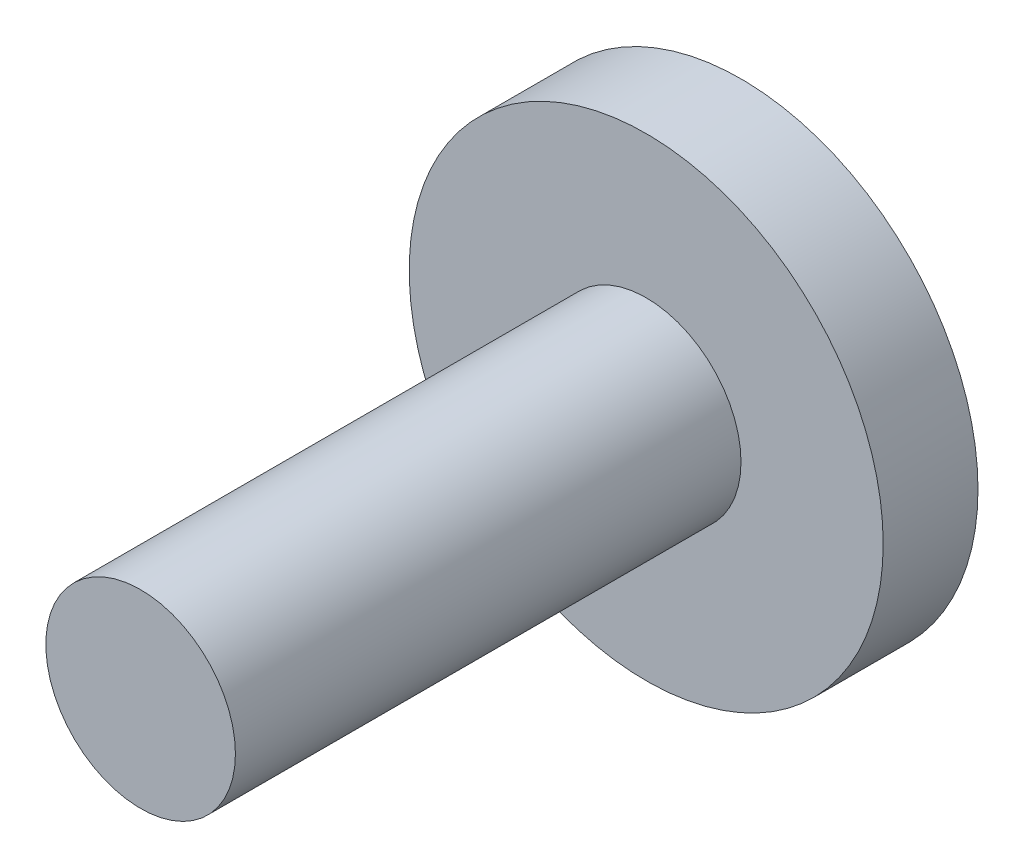
ISO-10303-21;
HEADER;
FILE_DESCRIPTION(('STEP AP214'),'2;1');
FILE_NAME('part.step','',(''),(''),'','','');
FILE_SCHEMA(('AUTOMOTIVE_DESIGN { 1 0 10303 214 1 1 1 1 }'));
ENDSEC;
DATA;
#1=APPLICATION_CONTEXT('core data for automotive mechanical design processes');
#2=APPLICATION_PROTOCOL_DEFINITION('international standard','automotive_design',2000,#1);
#3=PRODUCT_CONTEXT('',#1,'mechanical');
#4=PRODUCT('Part','Part','',(#3));
#5=PRODUCT_RELATED_PRODUCT_CATEGORY('part','',(#4));
#6=PRODUCT_DEFINITION_FORMATION('','',#4);
#7=PRODUCT_DEFINITION_CONTEXT('part definition',#1,'design');
#8=PRODUCT_DEFINITION('design','',#6,#7);
#9=PRODUCT_DEFINITION_SHAPE('','',#8);
#10=(LENGTH_UNIT() NAMED_UNIT(*) SI_UNIT(.MILLI.,.METRE.));
#11=(NAMED_UNIT(*) PLANE_ANGLE_UNIT() SI_UNIT($,.RADIAN.));
#12=(NAMED_UNIT(*) SI_UNIT($,.STERADIAN.) SOLID_ANGLE_UNIT());
#13=UNCERTAINTY_MEASURE_WITH_UNIT(LENGTH_MEASURE(1.E-05),#10,'distance_accuracy_value','');
#14=(GEOMETRIC_REPRESENTATION_CONTEXT(3) GLOBAL_UNCERTAINTY_ASSIGNED_CONTEXT((#13)) GLOBAL_UNIT_ASSIGNED_CONTEXT((#10,
#11,#12)) REPRESENTATION_CONTEXT('',''));
#15=CARTESIAN_POINT('',(0.,0.,0.));
#16=DIRECTION('',(0.,0.,1.));
#17=DIRECTION('',(1.,0.,0.));
#18=AXIS2_PLACEMENT_3D('',#15,#16,#17);
#19=CARTESIAN_POINT('',(0.,0.,19.));
#20=DIRECTION('',(0.,0.,-1.));
#21=DIRECTION('',(-1.,0.,0.));
#22=AXIS2_PLACEMENT_3D('',#19,#20,#21);
#23=CYLINDRICAL_SURFACE('',#22,3.);
#24=CARTESIAN_POINT('',(0.,0.,3.));
#25=DIRECTION('',(0.,0.,1.));
#26=DIRECTION('',(1.,0.,0.));
#27=AXIS2_PLACEMENT_3D('',#24,#25,#26);
#28=CIRCLE('',#27,3.);
#29=CARTESIAN_POINT('',(3.,0.,3.));
#30=VERTEX_POINT('',#29);
#31=EDGE_CURVE('E55',#30,#30,#28,.T.);
#32=ORIENTED_EDGE('',*,*,#31,.T.);
#33=EDGE_LOOP('',(#32));
#34=FACE_BOUND('',#33,.T.);
#35=CARTESIAN_POINT('',(0.,0.,19.));
#36=DIRECTION('',(0.,0.,1.));
#37=DIRECTION('',(1.,0.,0.));
#38=AXIS2_PLACEMENT_3D('',#35,#36,#37);
#39=CIRCLE('',#38,3.);
#40=CARTESIAN_POINT('',(3.,0.,19.));
#41=VERTEX_POINT('',#40);
#42=EDGE_CURVE('E10',#41,#41,#39,.T.);
#43=ORIENTED_EDGE('',*,*,#42,.F.);
#44=EDGE_LOOP('',(#43));
#45=FACE_BOUND('',#44,.T.);
#46=ADVANCED_FACE('F37',(#34,#45),#23,.T.);
#47=CARTESIAN_POINT('',(0.,0.,19.));
#48=DIRECTION('',(0.,0.,1.));
#49=DIRECTION('',(1.,0.,0.));
#50=AXIS2_PLACEMENT_3D('',#47,#48,#49);
#51=PLANE('',#50);
#52=ORIENTED_EDGE('',*,*,#42,.T.);
#53=EDGE_LOOP('',(#52));
#54=FACE_BOUND('',#53,.T.);
#55=ADVANCED_FACE('F66',(#54),#51,.T.);
#56=CARTESIAN_POINT('',(0.,0.,3.));
#57=DIRECTION('',(0.,0.,1.));
#58=DIRECTION('',(1.,0.,0.));
#59=AXIS2_PLACEMENT_3D('',#56,#57,#58);
#60=PLANE('',#59);
#61=CARTESIAN_POINT('',(0.,0.,3.));
#62=DIRECTION('',(0.,0.,1.));
#63=DIRECTION('',(1.,0.,0.));
#64=AXIS2_PLACEMENT_3D('',#61,#62,#63);
#65=CIRCLE('',#64,7.5);
#66=CARTESIAN_POINT('',(7.5,0.,3.));
#67=VERTEX_POINT('',#66);
#68=EDGE_CURVE('E44',#67,#67,#65,.T.);
#69=ORIENTED_EDGE('',*,*,#68,.T.);
#70=EDGE_LOOP('',(#69));
#71=FACE_BOUND('',#70,.T.);
#72=ORIENTED_EDGE('',*,*,#31,.F.);
#73=EDGE_LOOP('',(#72));
#74=FACE_BOUND('',#73,.T.);
#75=ADVANCED_FACE('F63',(#71,#74),#60,.T.);
#76=CARTESIAN_POINT('',(0.,0.,3.));
#77=DIRECTION('',(0.,0.,-1.));
#78=DIRECTION('',(-1.,0.,0.));
#79=AXIS2_PLACEMENT_3D('',#76,#77,#78);
#80=CYLINDRICAL_SURFACE('',#79,7.5);
#81=ORIENTED_EDGE('',*,*,#68,.F.);
#82=EDGE_LOOP('',(#81));
#83=FACE_BOUND('',#82,.T.);
#84=CARTESIAN_POINT('',(0.,0.,0.));
#85=DIRECTION('',(0.,0.,1.));
#86=DIRECTION('',(1.,0.,0.));
#87=AXIS2_PLACEMENT_3D('',#84,#85,#86);
#88=CIRCLE('',#87,7.5);
#89=CARTESIAN_POINT('',(7.5,0.,0.));
#90=VERTEX_POINT('',#89);
#91=EDGE_CURVE('E49',#90,#90,#88,.T.);
#92=ORIENTED_EDGE('',*,*,#91,.T.);
#93=EDGE_LOOP('',(#92));
#94=FACE_BOUND('',#93,.T.);
#95=ADVANCED_FACE('F65',(#83,#94),#80,.T.);
#96=CARTESIAN_POINT('',(0.,0.,0.));
#97=DIRECTION('',(0.,0.,1.));
#98=DIRECTION('',(1.,0.,0.));
#99=AXIS2_PLACEMENT_3D('',#96,#97,#98);
#100=PLANE('',#99);
#101=ORIENTED_EDGE('',*,*,#91,.F.);
#102=EDGE_LOOP('',(#101));
#103=FACE_BOUND('',#102,.T.);
#104=ADVANCED_FACE('F72',(#103),#100,.F.);
#105=CLOSED_SHELL('',(#46,#55,#75,#95,#104));
#106=MANIFOLD_SOLID_BREP('B2',#105);
#107=ADVANCED_BREP_SHAPE_REPRESENTATION('',(#18,#106),#14);
#108=SHAPE_DEFINITION_REPRESENTATION(#9,#107);
ENDSEC;
END-ISO-10303-21;
